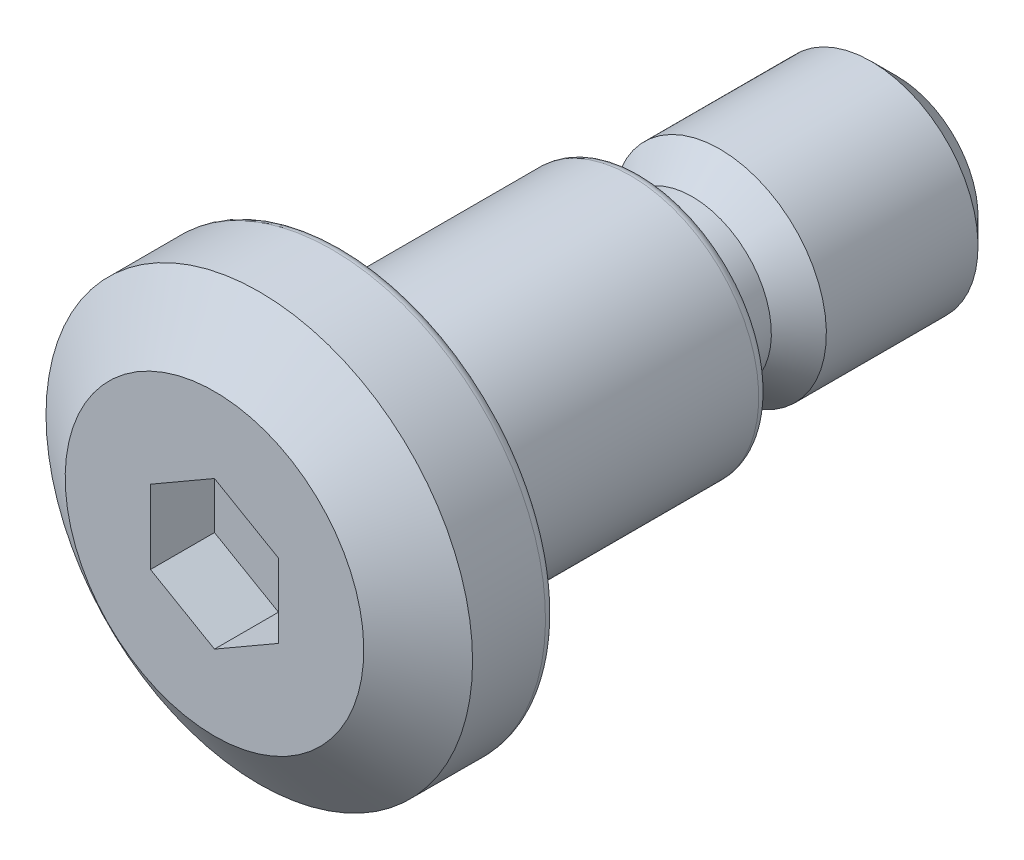
ISO-10303-21;
HEADER;
FILE_DESCRIPTION(('STEP AP214'),'2;1');
FILE_NAME('part.step','',(''),(''),'','','');
FILE_SCHEMA(('AUTOMOTIVE_DESIGN { 1 0 10303 214 1 1 1 1 }'));
ENDSEC;
DATA;
#1=APPLICATION_CONTEXT('core data for automotive mechanical design processes');
#2=APPLICATION_PROTOCOL_DEFINITION('international standard','automotive_design',2000,#1);
#3=PRODUCT_CONTEXT('',#1,'mechanical');
#4=PRODUCT('Part','Part','',(#3));
#5=PRODUCT_RELATED_PRODUCT_CATEGORY('part','',(#4));
#6=PRODUCT_DEFINITION_FORMATION('','',#4);
#7=PRODUCT_DEFINITION_CONTEXT('part definition',#1,'design');
#8=PRODUCT_DEFINITION('design','',#6,#7);
#9=PRODUCT_DEFINITION_SHAPE('','',#8);
#10=(LENGTH_UNIT() NAMED_UNIT(*) SI_UNIT(.MILLI.,.METRE.));
#11=(NAMED_UNIT(*) PLANE_ANGLE_UNIT() SI_UNIT($,.RADIAN.));
#12=(NAMED_UNIT(*) SI_UNIT($,.STERADIAN.) SOLID_ANGLE_UNIT());
#13=UNCERTAINTY_MEASURE_WITH_UNIT(LENGTH_MEASURE(1.E-05),#10,'distance_accuracy_value','');
#14=(GEOMETRIC_REPRESENTATION_CONTEXT(3) GLOBAL_UNCERTAINTY_ASSIGNED_CONTEXT((#13)) GLOBAL_UNIT_ASSIGNED_CONTEXT((#10,
#11,#12)) REPRESENTATION_CONTEXT('',''));
#15=CARTESIAN_POINT('',(0.,0.,0.));
#16=DIRECTION('',(0.,0.,1.));
#17=DIRECTION('',(1.,0.,0.));
#18=AXIS2_PLACEMENT_3D('',#15,#16,#17);
#19=CARTESIAN_POINT('',(0.,0.,-16.));
#20=DIRECTION('',(0.,0.,-1.));
#21=DIRECTION('',(0.,1.,0.));
#22=AXIS2_PLACEMENT_3D('',#19,#20,#21);
#23=CYLINDRICAL_SURFACE('',#22,3.);
#24=CARTESIAN_POINT('',(0.,0.,-3.6));
#25=DIRECTION('',(0.,0.,-1.));
#26=DIRECTION('',(0.,1.,0.));
#27=AXIS2_PLACEMENT_3D('',#24,#25,#26);
#28=CIRCLE('',#27,3.);
#29=CARTESIAN_POINT('',(0.,3.,-3.6));
#30=VERTEX_POINT('',#29);
#31=EDGE_CURVE('E42',#30,#30,#28,.T.);
#32=ORIENTED_EDGE('',*,*,#31,.T.);
#33=EDGE_LOOP('',(#32));
#34=FACE_BOUND('',#33,.T.);
#35=CARTESIAN_POINT('',(0.,0.,-9.76000000000001));
#36=DIRECTION('',(0.,0.,-1.));
#37=DIRECTION('',(0.,1.,0.));
#38=AXIS2_PLACEMENT_3D('',#35,#36,#37);
#39=CIRCLE('',#38,3.);
#40=CARTESIAN_POINT('',(0.,3.,-9.76000000000001));
#41=VERTEX_POINT('',#40);
#42=EDGE_CURVE('E168',#41,#41,#39,.F.);
#43=ORIENTED_EDGE('',*,*,#42,.T.);
#44=EDGE_LOOP('',(#43));
#45=FACE_BOUND('',#44,.T.);
#46=ADVANCED_FACE('F34',(#34,#45),#23,.T.);
#47=CARTESIAN_POINT('',(0.,3.,-10.));
#48=DIRECTION('',(0.,0.,-1.));
#49=DIRECTION('',(0.,1.,0.));
#50=AXIS2_PLACEMENT_3D('',#47,#48,#49);
#51=PLANE('',#50);
#52=CARTESIAN_POINT('',(0.,0.,-10.));
#53=DIRECTION('',(0.,0.,-1.));
#54=DIRECTION('',(0.,1.,0.));
#55=AXIS2_PLACEMENT_3D('',#52,#53,#54);
#56=CIRCLE('',#55,2.76);
#57=CARTESIAN_POINT('',(0.,2.76,-10.));
#58=VERTEX_POINT('',#57);
#59=EDGE_CURVE('E165',#58,#58,#56,.T.);
#60=ORIENTED_EDGE('',*,*,#59,.T.);
#61=EDGE_LOOP('',(#60));
#62=FACE_BOUND('',#61,.T.);
#63=CARTESIAN_POINT('',(0.,0.,-10.));
#64=DIRECTION('',(0.,0.,-1.));
#65=DIRECTION('',(0.,1.,0.));
#66=AXIS2_PLACEMENT_3D('',#63,#64,#65);
#67=CIRCLE('',#66,2.50000000000001);
#68=CARTESIAN_POINT('',(0.,2.5,-10.));
#69=VERTEX_POINT('',#68);
#70=EDGE_CURVE('E147',#69,#69,#67,.T.);
#71=ORIENTED_EDGE('',*,*,#70,.F.);
#72=EDGE_LOOP('',(#71));
#73=FACE_BOUND('',#72,.T.);
#74=ADVANCED_FACE('F191',(#62,#73),#51,.T.);
#75=CARTESIAN_POINT('',(0.,0.,0.));
#76=DIRECTION('',(0.,0.,1.));
#77=DIRECTION('',(0.,-1.,0.));
#78=AXIS2_PLACEMENT_3D('',#75,#76,#77);
#79=PLANE('',#78);
#80=CARTESIAN_POINT('',(0.,0.,0.));
#81=DIRECTION('',(0.,0.,1.));
#82=DIRECTION('',(0.,-1.,0.));
#83=AXIS2_PLACEMENT_3D('',#80,#81,#82);
#84=CIRCLE('',#83,3.49999999999999);
#85=CARTESIAN_POINT('',(0.,-3.49999999999999,0.));
#86=VERTEX_POINT('',#85);
#87=EDGE_CURVE('E162',#86,#86,#84,.T.);
#88=ORIENTED_EDGE('',*,*,#87,.T.);
#89=EDGE_LOOP('',(#88));
#90=FACE_BOUND('',#89,.T.);
#91=DIRECTION('',(-0.866025403784439,0.499999999999999,0.));
#92=VECTOR('',#91,1.);
#93=CARTESIAN_POINT('',(1.5,0.866025403784439,0.));
#94=LINE('',#93,#92);
#95=CARTESIAN_POINT('',(1.5,0.866025403784439,0.));
#96=VERTEX_POINT('',#95);
#97=CARTESIAN_POINT('',(0.,1.73205080756888,0.));
#98=VERTEX_POINT('',#97);
#99=EDGE_CURVE('E49',#96,#98,#94,.T.);
#100=ORIENTED_EDGE('',*,*,#99,.F.);
#101=DIRECTION('',(0.,1.,0.));
#102=VECTOR('',#101,1.);
#103=CARTESIAN_POINT('',(1.5,-0.866025403784438,0.));
#104=LINE('',#103,#102);
#105=CARTESIAN_POINT('',(1.5,-0.866025403784438,0.));
#106=VERTEX_POINT('',#105);
#107=EDGE_CURVE('E132',#106,#96,#104,.T.);
#108=ORIENTED_EDGE('',*,*,#107,.F.);
#109=DIRECTION('',(0.866025403784438,0.5,0.));
#110=VECTOR('',#109,1.);
#111=CARTESIAN_POINT('',(0.,-1.73205080756888,0.));
#112=LINE('',#111,#110);
#113=CARTESIAN_POINT('',(0.,-1.73205080756888,0.));
#114=VERTEX_POINT('',#113);
#115=EDGE_CURVE('E130',#114,#106,#112,.T.);
#116=ORIENTED_EDGE('',*,*,#115,.F.);
#117=DIRECTION('',(0.866025403784439,-0.5,0.));
#118=VECTOR('',#117,1.);
#119=CARTESIAN_POINT('',(-1.5,-0.866025403784438,0.));
#120=LINE('',#119,#118);
#121=CARTESIAN_POINT('',(-1.5,-0.866025403784438,0.));
#122=VERTEX_POINT('',#121);
#123=EDGE_CURVE('E97',#122,#114,#120,.T.);
#124=ORIENTED_EDGE('',*,*,#123,.F.);
#125=DIRECTION('',(0.,-1.,0.));
#126=VECTOR('',#125,1.);
#127=CARTESIAN_POINT('',(-1.5,0.866025403784438,0.));
#128=LINE('',#127,#126);
#129=CARTESIAN_POINT('',(-1.5,0.866025403784438,0.));
#130=VERTEX_POINT('',#129);
#131=EDGE_CURVE('E126',#130,#122,#128,.T.);
#132=ORIENTED_EDGE('',*,*,#131,.F.);
#133=DIRECTION('',(-0.866025403784438,-0.500000000000001,0.));
#134=VECTOR('',#133,1.);
#135=CARTESIAN_POINT('',(0.,1.73205080756888,0.));
#136=LINE('',#135,#134);
#137=EDGE_CURVE('E123',#98,#130,#136,.T.);
#138=ORIENTED_EDGE('',*,*,#137,.F.);
#139=EDGE_LOOP('',(#100,#108,#116,#124,#132,#138));
#140=FACE_BOUND('',#139,.T.);
#141=ADVANCED_FACE('F196',(#90,#140),#79,.T.);
#142=CARTESIAN_POINT('',(0.,0.,-16.));
#143=DIRECTION('',(0.,0.,-1.));
#144=DIRECTION('',(0.,1.,0.));
#145=AXIS2_PLACEMENT_3D('',#142,#143,#144);
#146=CYLINDRICAL_SURFACE('',#145,5.);
#147=CARTESIAN_POINT('',(0.,0.,-2.76));
#148=DIRECTION('',(0.,0.,-1.));
#149=DIRECTION('',(0.,1.,0.));
#150=AXIS2_PLACEMENT_3D('',#147,#148,#149);
#151=CIRCLE('',#150,5.);
#152=CARTESIAN_POINT('',(0.,5.,-2.76));
#153=VERTEX_POINT('',#152);
#154=EDGE_CURVE('E174',#153,#153,#151,.F.);
#155=ORIENTED_EDGE('',*,*,#154,.T.);
#156=EDGE_LOOP('',(#155));
#157=FACE_BOUND('',#156,.T.);
#158=CARTESIAN_POINT('',(0.,0.,-1.05031130731457));
#159=DIRECTION('',(0.,0.,1.));
#160=DIRECTION('',(0.,-1.,0.));
#161=AXIS2_PLACEMENT_3D('',#158,#159,#160);
#162=CIRCLE('',#161,5.);
#163=CARTESIAN_POINT('',(0.,-5.,-1.05031130731457));
#164=VERTEX_POINT('',#163);
#165=EDGE_CURVE('E159',#164,#164,#162,.F.);
#166=ORIENTED_EDGE('',*,*,#165,.T.);
#167=EDGE_LOOP('',(#166));
#168=FACE_BOUND('',#167,.T.);
#169=ADVANCED_FACE('F232',(#157,#168),#146,.T.);
#170=CARTESIAN_POINT('',(0.,5.,-3.));
#171=DIRECTION('',(0.,0.,-1.));
#172=DIRECTION('',(0.,1.,0.));
#173=AXIS2_PLACEMENT_3D('',#170,#171,#172);
#174=PLANE('',#173);
#175=CARTESIAN_POINT('',(0.,0.,-3.));
#176=DIRECTION('',(0.,0.,-1.));
#177=DIRECTION('',(0.,1.,0.));
#178=AXIS2_PLACEMENT_3D('',#175,#176,#177);
#179=CIRCLE('',#178,3.6);
#180=CARTESIAN_POINT('',(0.,3.6,-3.));
#181=VERTEX_POINT('',#180);
#182=EDGE_CURVE('E11',#181,#181,#179,.F.);
#183=ORIENTED_EDGE('',*,*,#182,.T.);
#184=EDGE_LOOP('',(#183));
#185=FACE_BOUND('',#184,.T.);
#186=CARTESIAN_POINT('',(0.,0.,-3.));
#187=DIRECTION('',(0.,0.,-1.));
#188=DIRECTION('',(0.,1.,0.));
#189=AXIS2_PLACEMENT_3D('',#186,#187,#188);
#190=CIRCLE('',#189,4.76);
#191=CARTESIAN_POINT('',(0.,4.76,-3.));
#192=VERTEX_POINT('',#191);
#193=EDGE_CURVE('E171',#192,#192,#190,.T.);
#194=ORIENTED_EDGE('',*,*,#193,.T.);
#195=EDGE_LOOP('',(#194));
#196=FACE_BOUND('',#195,.T.);
#197=ADVANCED_FACE('F222',(#185,#196),#174,.T.);
#198=CARTESIAN_POINT('',(0.,0.,-10.645));
#199=DIRECTION('',(0.,0.,-1.));
#200=DIRECTION('',(0.,1.,0.));
#201=AXIS2_PLACEMENT_3D('',#198,#199,#200);
#202=TOROIDAL_SURFACE('',#201,2.50000000000001,0.645);
#203=CARTESIAN_POINT('',(0.,0.,-10.645));
#204=DIRECTION('',(0.,0.,-1.));
#205=DIRECTION('',(0.,1.,0.));
#206=AXIS2_PLACEMENT_3D('',#203,#204,#205);
#207=CIRCLE('',#206,1.855);
#208=CARTESIAN_POINT('',(0.,1.855,-10.645));
#209=VERTEX_POINT('',#208);
#210=EDGE_CURVE('E144',#209,#209,#207,.T.);
#211=ORIENTED_EDGE('',*,*,#210,.F.);
#212=EDGE_LOOP('',(#211));
#213=FACE_BOUND('',#212,.T.);
#214=ORIENTED_EDGE('',*,*,#70,.T.);
#215=EDGE_LOOP('',(#214));
#216=FACE_BOUND('',#215,.T.);
#217=ADVANCED_FACE('F219',(#213,#216),#202,.F.);
#218=CARTESIAN_POINT('',(0.,0.,-16.));
#219=DIRECTION('',(0.,0.,-1.));
#220=DIRECTION('',(0.,1.,0.));
#221=AXIS2_PLACEMENT_3D('',#218,#219,#220);
#222=CYLINDRICAL_SURFACE('',#221,1.855);
#223=CARTESIAN_POINT('',(0.,0.,-11.2));
#224=DIRECTION('',(0.,0.,-1.));
#225=DIRECTION('',(0.,1.,0.));
#226=AXIS2_PLACEMENT_3D('',#223,#224,#225);
#227=CIRCLE('',#226,1.855);
#228=CARTESIAN_POINT('',(0.,1.855,-11.2));
#229=VERTEX_POINT('',#228);
#230=EDGE_CURVE('E136',#229,#229,#227,.T.);
#231=ORIENTED_EDGE('',*,*,#230,.F.);
#232=EDGE_LOOP('',(#231));
#233=FACE_BOUND('',#232,.T.);
#234=ORIENTED_EDGE('',*,*,#210,.T.);
#235=EDGE_LOOP('',(#234));
#236=FACE_BOUND('',#235,.T.);
#237=ADVANCED_FACE('F221',(#233,#236),#222,.T.);
#238=CARTESIAN_POINT('',(0.,0.,-11.2));
#239=DIRECTION('',(0.,0.,-1.));
#240=DIRECTION('',(0.,1.,0.));
#241=AXIS2_PLACEMENT_3D('',#238,#239,#240);
#242=CONICAL_SURFACE('',#241,1.855,0.785398163397443);
#243=CARTESIAN_POINT('',(0.,0.,-11.845));
#244=DIRECTION('',(0.,0.,-1.));
#245=DIRECTION('',(0.,1.,0.));
#246=AXIS2_PLACEMENT_3D('',#243,#244,#245);
#247=CIRCLE('',#246,2.50000000000001);
#248=CARTESIAN_POINT('',(0.,2.5,-11.845));
#249=VERTEX_POINT('',#248);
#250=EDGE_CURVE('E150',#249,#249,#247,.F.);
#251=ORIENTED_EDGE('',*,*,#250,.T.);
#252=EDGE_LOOP('',(#251));
#253=FACE_BOUND('',#252,.T.);
#254=ORIENTED_EDGE('',*,*,#230,.T.);
#255=EDGE_LOOP('',(#254));
#256=FACE_BOUND('',#255,.T.);
#257=ADVANCED_FACE('F229',(#253,#256),#242,.T.);
#258=CARTESIAN_POINT('',(0.,2.5,-16.));
#259=DIRECTION('',(0.,0.,-1.));
#260=DIRECTION('',(0.,1.,0.));
#261=AXIS2_PLACEMENT_3D('',#258,#259,#260);
#262=PLANE('',#261);
#263=CARTESIAN_POINT('',(0.,0.,-16.));
#264=DIRECTION('',(0.,0.,-1.));
#265=DIRECTION('',(0.,1.,0.));
#266=AXIS2_PLACEMENT_3D('',#263,#264,#265);
#267=CIRCLE('',#266,1.9);
#268=CARTESIAN_POINT('',(0.,1.9,-16.));
#269=VERTEX_POINT('',#268);
#270=EDGE_CURVE('E153',#269,#269,#267,.T.);
#271=ORIENTED_EDGE('',*,*,#270,.T.);
#272=EDGE_LOOP('',(#271));
#273=FACE_BOUND('',#272,.T.);
#274=ADVANCED_FACE('F244',(#273),#262,.T.);
#275=CARTESIAN_POINT('',(0.,0.,-16.));
#276=DIRECTION('',(0.,0.,-1.));
#277=DIRECTION('',(0.,1.,0.));
#278=AXIS2_PLACEMENT_3D('',#275,#276,#277);
#279=CYLINDRICAL_SURFACE('',#278,2.50000000000001);
#280=CARTESIAN_POINT('',(0.,0.,-15.4));
#281=DIRECTION('',(0.,0.,-1.));
#282=DIRECTION('',(0.,1.,0.));
#283=AXIS2_PLACEMENT_3D('',#280,#281,#282);
#284=CIRCLE('',#283,2.50000000000001);
#285=CARTESIAN_POINT('',(0.,2.5,-15.4));
#286=VERTEX_POINT('',#285);
#287=EDGE_CURVE('E156',#286,#286,#284,.F.);
#288=ORIENTED_EDGE('',*,*,#287,.T.);
#289=EDGE_LOOP('',(#288));
#290=FACE_BOUND('',#289,.T.);
#291=ORIENTED_EDGE('',*,*,#250,.F.);
#292=EDGE_LOOP('',(#291));
#293=FACE_BOUND('',#292,.T.);
#294=ADVANCED_FACE('F246',(#290,#293),#279,.T.);
#295=CARTESIAN_POINT('',(1.5,0.866025403784439,-1.5));
#296=DIRECTION('',(0.499999999999999,0.866025403784439,0.));
#297=DIRECTION('',(-0.866025403784439,0.499999999999999,0.));
#298=AXIS2_PLACEMENT_3D('',#295,#296,#297);
#299=PLANE('',#298);
#300=ORIENTED_EDGE('',*,*,#99,.T.);
#301=DIRECTION('',(0.,0.,1.));
#302=VECTOR('',#301,1.);
#303=CARTESIAN_POINT('',(0.,1.73205080756888,-1.5));
#304=LINE('',#303,#302);
#305=CARTESIAN_POINT('',(0.,1.73205080756888,-1.5));
#306=VERTEX_POINT('',#305);
#307=EDGE_CURVE('E79',#306,#98,#304,.T.);
#308=ORIENTED_EDGE('',*,*,#307,.F.);
#309=DIRECTION('',(-0.866025403784439,0.499999999999999,0.));
#310=VECTOR('',#309,1.);
#311=CARTESIAN_POINT('',(1.5,0.866025403784439,-1.5));
#312=LINE('',#311,#310);
#313=CARTESIAN_POINT('',(1.5,0.866025403784439,-1.5));
#314=VERTEX_POINT('',#313);
#315=EDGE_CURVE('E134',#314,#306,#312,.T.);
#316=ORIENTED_EDGE('',*,*,#315,.F.);
#317=DIRECTION('',(0.,0.,1.));
#318=VECTOR('',#317,1.);
#319=CARTESIAN_POINT('',(1.5,0.866025403784439,-1.5));
#320=LINE('',#319,#318);
#321=EDGE_CURVE('E57',#314,#96,#320,.T.);
#322=ORIENTED_EDGE('',*,*,#321,.T.);
#323=EDGE_LOOP('',(#300,#308,#316,#322));
#324=FACE_BOUND('',#323,.T.);
#325=ADVANCED_FACE('F249',(#324),#299,.F.);
#326=CARTESIAN_POINT('',(1.5,-0.866025403784438,-1.5));
#327=DIRECTION('',(1.,0.,0.));
#328=DIRECTION('',(0.,0.,-1.));
#329=AXIS2_PLACEMENT_3D('',#326,#327,#328);
#330=PLANE('',#329);
#331=ORIENTED_EDGE('',*,*,#107,.T.);
#332=ORIENTED_EDGE('',*,*,#321,.F.);
#333=DIRECTION('',(0.,1.,0.));
#334=VECTOR('',#333,1.);
#335=CARTESIAN_POINT('',(1.5,-0.866025403784438,-1.5));
#336=LINE('',#335,#334);
#337=CARTESIAN_POINT('',(1.5,-0.866025403784438,-1.5));
#338=VERTEX_POINT('',#337);
#339=EDGE_CURVE('E109',#338,#314,#336,.T.);
#340=ORIENTED_EDGE('',*,*,#339,.F.);
#341=DIRECTION('',(0.,0.,1.));
#342=VECTOR('',#341,1.);
#343=CARTESIAN_POINT('',(1.5,-0.866025403784438,-1.5));
#344=LINE('',#343,#342);
#345=EDGE_CURVE('E101',#338,#106,#344,.T.);
#346=ORIENTED_EDGE('',*,*,#345,.T.);
#347=EDGE_LOOP('',(#331,#332,#340,#346));
#348=FACE_BOUND('',#347,.T.);
#349=ADVANCED_FACE('F254',(#348),#330,.F.);
#350=CARTESIAN_POINT('',(0.,-1.73205080756888,-1.5));
#351=DIRECTION('',(0.5,-0.866025403784438,0.));
#352=DIRECTION('',(0.866025403784438,0.5,0.));
#353=AXIS2_PLACEMENT_3D('',#350,#351,#352);
#354=PLANE('',#353);
#355=ORIENTED_EDGE('',*,*,#115,.T.);
#356=ORIENTED_EDGE('',*,*,#345,.F.);
#357=DIRECTION('',(0.866025403784438,0.5,0.));
#358=VECTOR('',#357,1.);
#359=CARTESIAN_POINT('',(0.,-1.73205080756888,-1.5));
#360=LINE('',#359,#358);
#361=CARTESIAN_POINT('',(0.,-1.73205080756888,-1.5));
#362=VERTEX_POINT('',#361);
#363=EDGE_CURVE('E105',#362,#338,#360,.T.);
#364=ORIENTED_EDGE('',*,*,#363,.F.);
#365=DIRECTION('',(0.,0.,1.));
#366=VECTOR('',#365,1.);
#367=CARTESIAN_POINT('',(0.,-1.73205080756888,-1.5));
#368=LINE('',#367,#366);
#369=EDGE_CURVE('E90',#362,#114,#368,.T.);
#370=ORIENTED_EDGE('',*,*,#369,.T.);
#371=EDGE_LOOP('',(#355,#356,#364,#370));
#372=FACE_BOUND('',#371,.T.);
#373=ADVANCED_FACE('F106',(#372),#354,.F.);
#374=CARTESIAN_POINT('',(-1.5,-0.866025403784438,-1.5));
#375=DIRECTION('',(-0.5,-0.866025403784439,0.));
#376=DIRECTION('',(0.866025403784439,-0.5,0.));
#377=AXIS2_PLACEMENT_3D('',#374,#375,#376);
#378=PLANE('',#377);
#379=ORIENTED_EDGE('',*,*,#123,.T.);
#380=ORIENTED_EDGE('',*,*,#369,.F.);
#381=DIRECTION('',(0.866025403784439,-0.5,0.));
#382=VECTOR('',#381,1.);
#383=CARTESIAN_POINT('',(-1.5,-0.866025403784438,-1.5));
#384=LINE('',#383,#382);
#385=CARTESIAN_POINT('',(-1.5,-0.866025403784438,-1.5));
#386=VERTEX_POINT('',#385);
#387=EDGE_CURVE('E94',#386,#362,#384,.T.);
#388=ORIENTED_EDGE('',*,*,#387,.F.);
#389=DIRECTION('',(0.,0.,1.));
#390=VECTOR('',#389,1.);
#391=CARTESIAN_POINT('',(-1.5,-0.866025403784438,-1.5));
#392=LINE('',#391,#390);
#393=EDGE_CURVE('E102',#386,#122,#392,.T.);
#394=ORIENTED_EDGE('',*,*,#393,.T.);
#395=EDGE_LOOP('',(#379,#380,#388,#394));
#396=FACE_BOUND('',#395,.T.);
#397=ADVANCED_FACE('F92',(#396),#378,.F.);
#398=CARTESIAN_POINT('',(-1.5,0.866025403784438,-1.5));
#399=DIRECTION('',(-1.,0.,0.));
#400=DIRECTION('',(0.,-1.,0.));
#401=AXIS2_PLACEMENT_3D('',#398,#399,#400);
#402=PLANE('',#401);
#403=ORIENTED_EDGE('',*,*,#131,.T.);
#404=ORIENTED_EDGE('',*,*,#393,.F.);
#405=DIRECTION('',(0.,-1.,0.));
#406=VECTOR('',#405,1.);
#407=CARTESIAN_POINT('',(-1.5,0.866025403784438,-1.5));
#408=LINE('',#407,#406);
#409=CARTESIAN_POINT('',(-1.5,0.866025403784438,-1.5));
#410=VERTEX_POINT('',#409);
#411=EDGE_CURVE('E115',#410,#386,#408,.T.);
#412=ORIENTED_EDGE('',*,*,#411,.F.);
#413=DIRECTION('',(0.,0.,1.));
#414=VECTOR('',#413,1.);
#415=CARTESIAN_POINT('',(-1.5,0.866025403784438,-1.5));
#416=LINE('',#415,#414);
#417=EDGE_CURVE('E139',#410,#130,#416,.T.);
#418=ORIENTED_EDGE('',*,*,#417,.T.);
#419=EDGE_LOOP('',(#403,#404,#412,#418));
#420=FACE_BOUND('',#419,.T.);
#421=ADVANCED_FACE('F270',(#420),#402,.F.);
#422=CARTESIAN_POINT('',(0.,1.73205080756888,-1.5));
#423=DIRECTION('',(-0.5,0.866025403784438,0.));
#424=DIRECTION('',(-0.866025403784438,-0.500000000000001,0.));
#425=AXIS2_PLACEMENT_3D('',#422,#423,#424);
#426=PLANE('',#425);
#427=ORIENTED_EDGE('',*,*,#137,.T.);
#428=ORIENTED_EDGE('',*,*,#417,.F.);
#429=DIRECTION('',(-0.866025403784438,-0.500000000000001,0.));
#430=VECTOR('',#429,1.);
#431=CARTESIAN_POINT('',(0.,1.73205080756888,-1.5));
#432=LINE('',#431,#430);
#433=EDGE_CURVE('E117',#306,#410,#432,.T.);
#434=ORIENTED_EDGE('',*,*,#433,.F.);
#435=ORIENTED_EDGE('',*,*,#307,.T.);
#436=EDGE_LOOP('',(#427,#428,#434,#435));
#437=FACE_BOUND('',#436,.T.);
#438=ADVANCED_FACE('F267',(#437),#426,.F.);
#439=CARTESIAN_POINT('',(0.,0.,-1.5));
#440=DIRECTION('',(0.,0.,1.));
#441=DIRECTION('',(1.,0.,0.));
#442=AXIS2_PLACEMENT_3D('',#439,#440,#441);
#443=PLANE('',#442);
#444=ORIENTED_EDGE('',*,*,#315,.T.);
#445=ORIENTED_EDGE('',*,*,#433,.T.);
#446=ORIENTED_EDGE('',*,*,#411,.T.);
#447=ORIENTED_EDGE('',*,*,#387,.T.);
#448=ORIENTED_EDGE('',*,*,#363,.T.);
#449=ORIENTED_EDGE('',*,*,#339,.T.);
#450=EDGE_LOOP('',(#444,#445,#446,#447,#448,#449));
#451=FACE_BOUND('',#450,.T.);
#452=ADVANCED_FACE('F112',(#451),#443,.T.);
#453=CARTESIAN_POINT('',(0.,0.,-16.));
#454=DIRECTION('',(0.,0.,1.));
#455=DIRECTION('',(0.,-1.,0.));
#456=AXIS2_PLACEMENT_3D('',#453,#454,#455);
#457=CONICAL_SURFACE('',#456,1.9,0.785398163397443);
#458=ORIENTED_EDGE('',*,*,#287,.F.);
#459=EDGE_LOOP('',(#458));
#460=FACE_BOUND('',#459,.T.);
#461=ORIENTED_EDGE('',*,*,#270,.F.);
#462=EDGE_LOOP('',(#461));
#463=FACE_BOUND('',#462,.T.);
#464=ADVANCED_FACE('F201',(#460,#463),#457,.T.);
#465=CARTESIAN_POINT('',(0.,0.,-1.05031130731457));
#466=DIRECTION('',(0.,0.,-1.));
#467=DIRECTION('',(0.,1.,0.));
#468=AXIS2_PLACEMENT_3D('',#465,#466,#467);
#469=CONICAL_SURFACE('',#468,5.,0.959931088596883);
#470=ORIENTED_EDGE('',*,*,#87,.F.);
#471=EDGE_LOOP('',(#470));
#472=FACE_BOUND('',#471,.T.);
#473=ORIENTED_EDGE('',*,*,#165,.F.);
#474=EDGE_LOOP('',(#473));
#475=FACE_BOUND('',#474,.T.);
#476=ADVANCED_FACE('F204',(#472,#475),#469,.T.);
#477=CARTESIAN_POINT('',(0.,0.,-9.76000000000001));
#478=DIRECTION('',(0.,0.,-1.));
#479=DIRECTION('',(0.,1.,0.));
#480=AXIS2_PLACEMENT_3D('',#477,#478,#479);
#481=TOROIDAL_SURFACE('',#480,2.76,0.24);
#482=ORIENTED_EDGE('',*,*,#42,.F.);
#483=EDGE_LOOP('',(#482));
#484=FACE_BOUND('',#483,.T.);
#485=ORIENTED_EDGE('',*,*,#59,.F.);
#486=EDGE_LOOP('',(#485));
#487=FACE_BOUND('',#486,.T.);
#488=ADVANCED_FACE('F187',(#484,#487),#481,.T.);
#489=CARTESIAN_POINT('',(0.,0.,-2.76));
#490=DIRECTION('',(0.,0.,-1.));
#491=DIRECTION('',(0.,1.,0.));
#492=AXIS2_PLACEMENT_3D('',#489,#490,#491);
#493=TOROIDAL_SURFACE('',#492,4.76,0.24);
#494=ORIENTED_EDGE('',*,*,#154,.F.);
#495=EDGE_LOOP('',(#494));
#496=FACE_BOUND('',#495,.T.);
#497=ORIENTED_EDGE('',*,*,#193,.F.);
#498=EDGE_LOOP('',(#497));
#499=FACE_BOUND('',#498,.T.);
#500=ADVANCED_FACE('F182',(#496,#499),#493,.T.);
#501=CARTESIAN_POINT('',(0.,0.,-3.6));
#502=DIRECTION('',(0.,0.,-1.));
#503=DIRECTION('',(0.,1.,0.));
#504=AXIS2_PLACEMENT_3D('',#501,#502,#503);
#505=TOROIDAL_SURFACE('',#504,3.6,0.6);
#506=ORIENTED_EDGE('',*,*,#182,.F.);
#507=EDGE_LOOP('',(#506));
#508=FACE_BOUND('',#507,.T.);
#509=ORIENTED_EDGE('',*,*,#31,.F.);
#510=EDGE_LOOP('',(#509));
#511=FACE_BOUND('',#510,.T.);
#512=ADVANCED_FACE('F36',(#508,#511),#505,.F.);
#513=CLOSED_SHELL('',(#46,#74,#141,#169,#197,#217,#237,#257,#274,#294,#325,#349,#373,#397,#421,
#438,#452,#464,#476,#488,#500,#512));
#514=MANIFOLD_SOLID_BREP('B2',#513);
#515=ADVANCED_BREP_SHAPE_REPRESENTATION('',(#18,#514),#14);
#516=SHAPE_DEFINITION_REPRESENTATION(#9,#515);
ENDSEC;
END-ISO-10303-21;
